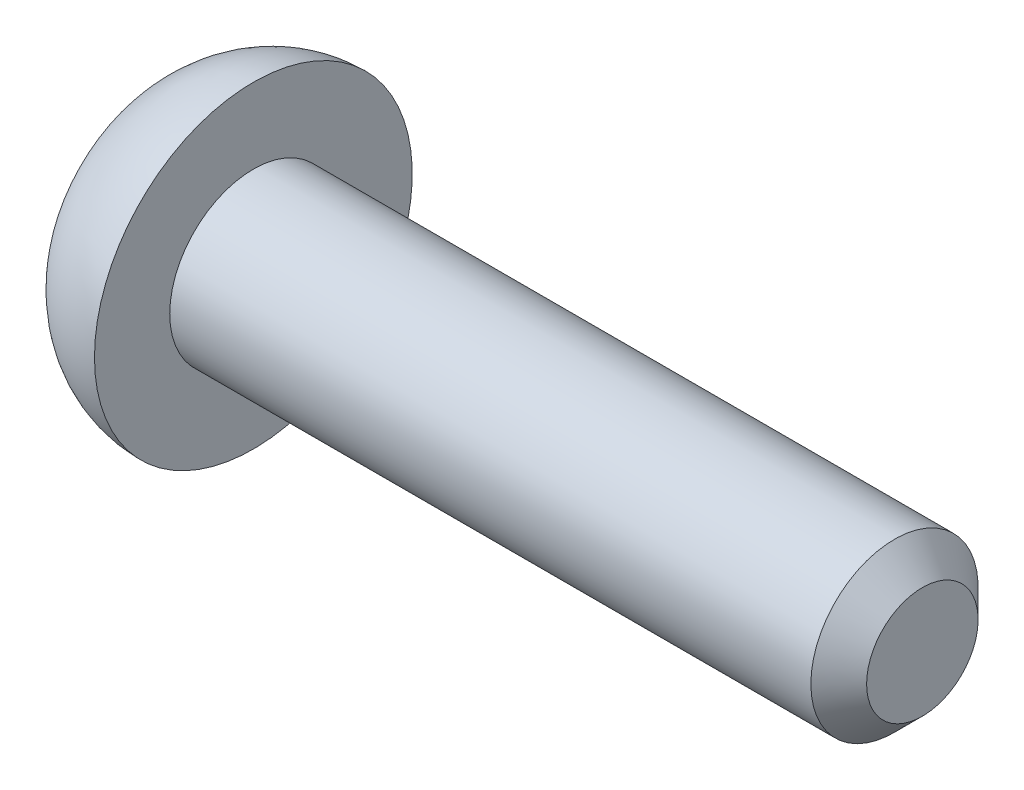
ISO-10303-21;
HEADER;
FILE_DESCRIPTION(('STEP AP214'),'2;1');
FILE_NAME('part.step','',(''),(''),'','','');
FILE_SCHEMA(('AUTOMOTIVE_DESIGN { 1 0 10303 214 1 1 1 1 }'));
ENDSEC;
DATA;
#1=APPLICATION_CONTEXT('core data for automotive mechanical design processes');
#2=APPLICATION_PROTOCOL_DEFINITION('international standard','automotive_design',2000,#1);
#3=PRODUCT_CONTEXT('',#1,'mechanical');
#4=PRODUCT('Part','Part','',(#3));
#5=PRODUCT_RELATED_PRODUCT_CATEGORY('part','',(#4));
#6=PRODUCT_DEFINITION_FORMATION('','',#4);
#7=PRODUCT_DEFINITION_CONTEXT('part definition',#1,'design');
#8=PRODUCT_DEFINITION('design','',#6,#7);
#9=PRODUCT_DEFINITION_SHAPE('','',#8);
#10=(LENGTH_UNIT() NAMED_UNIT(*) SI_UNIT(.MILLI.,.METRE.));
#11=(NAMED_UNIT(*) PLANE_ANGLE_UNIT() SI_UNIT($,.RADIAN.));
#12=(NAMED_UNIT(*) SI_UNIT($,.STERADIAN.) SOLID_ANGLE_UNIT());
#13=UNCERTAINTY_MEASURE_WITH_UNIT(LENGTH_MEASURE(1.E-05),#10,'distance_accuracy_value','');
#14=(GEOMETRIC_REPRESENTATION_CONTEXT(3) GLOBAL_UNCERTAINTY_ASSIGNED_CONTEXT((#13)) GLOBAL_UNIT_ASSIGNED_CONTEXT((#10,
#11,#12)) REPRESENTATION_CONTEXT('',''));
#15=CARTESIAN_POINT('',(0.,0.,0.));
#16=DIRECTION('',(0.,0.,1.));
#17=DIRECTION('',(1.,0.,0.));
#18=AXIS2_PLACEMENT_3D('',#15,#16,#17);
#19=CARTESIAN_POINT('',(-13.65,0.,-2.04903810567666));
#20=DIRECTION('',(1.,0.,0.));
#21=DIRECTION('',(0.,0.,-1.));
#22=AXIS2_PLACEMENT_3D('',#19,#20,#21);
#23=PLANE('',#22);
#24=CARTESIAN_POINT('',(-13.65,0.,0.));
#25=DIRECTION('',(-1.,0.,0.));
#26=DIRECTION('',(0.,0.,1.));
#27=AXIS2_PLACEMENT_3D('',#24,#25,#26);
#28=CIRCLE('',#27,2.04903810567666);
#29=CARTESIAN_POINT('',(-13.65,0.,2.04903810567666));
#30=VERTEX_POINT('',#29);
#31=EDGE_CURVE('E211',#30,#30,#28,.T.);
#32=ORIENTED_EDGE('',*,*,#31,.T.);
#33=EDGE_LOOP('',(#32));
#34=FACE_BOUND('',#33,.T.);
#35=CARTESIAN_POINT('',(-13.65,2.04903810567666,0.));
#36=DIRECTION('',(1.,0.,0.));
#37=DIRECTION('',(0.,0.,1.));
#38=AXIS2_PLACEMENT_3D('',#35,#36,#37);
#39=CIRCLE('',#38,1.02907378905691);
#40=CARTESIAN_POINT('',(-13.65,1.20759961003623,0.592430689092257));
#41=VERTEX_POINT('',#40);
#42=CARTESIAN_POINT('',(-13.65,1.20759961003623,-0.592430689092258));
#43=VERTEX_POINT('',#42);
#44=EDGE_CURVE('E157',#41,#43,#39,.T.);
#45=ORIENTED_EDGE('',*,*,#44,.F.);
#46=CARTESIAN_POINT('',(-13.65,1.12583302491977,0.650000000000001));
#47=DIRECTION('',(-1.,0.,0.));
#48=DIRECTION('',(0.,0.,1.));
#49=AXIS2_PLACEMENT_3D('',#46,#47,#48);
#50=CIRCLE('',#49,0.1);
#51=CARTESIAN_POINT('',(-13.65,1.11685983175353,0.74959659534543));
#52=VERTEX_POINT('',#51);
#53=EDGE_CURVE('E47',#52,#41,#50,.T.);
#54=ORIENTED_EDGE('',*,*,#53,.F.);
#55=CARTESIAN_POINT('',(-13.65,1.02451905283833,1.77451905283833));
#56=DIRECTION('',(1.,0.,0.));
#57=DIRECTION('',(0.,0.,1.));
#58=AXIS2_PLACEMENT_3D('',#55,#56,#57);
#59=CIRCLE('',#58,1.02907378905691);
#60=CARTESIAN_POINT('',(-13.65,0.0907397782827011,1.34202728443769));
#61=VERTEX_POINT('',#60);
#62=EDGE_CURVE('E184',#61,#52,#59,.T.);
#63=ORIENTED_EDGE('',*,*,#62,.F.);
#64=CARTESIAN_POINT('',(-13.65,0.,1.3));
#65=DIRECTION('',(-1.,0.,0.));
#66=DIRECTION('',(0.,0.,1.));
#67=AXIS2_PLACEMENT_3D('',#64,#65,#66);
#68=CIRCLE('',#67,0.1);
#69=CARTESIAN_POINT('',(-13.65,-0.0907397782827009,1.34202728443769));
#70=VERTEX_POINT('',#69);
#71=EDGE_CURVE('E182',#70,#61,#68,.T.);
#72=ORIENTED_EDGE('',*,*,#71,.F.);
#73=CARTESIAN_POINT('',(-13.65,-1.02451905283833,1.77451905283833));
#74=DIRECTION('',(1.,0.,0.));
#75=DIRECTION('',(0.,0.,1.));
#76=AXIS2_PLACEMENT_3D('',#73,#74,#75);
#77=CIRCLE('',#76,1.02907378905691);
#78=CARTESIAN_POINT('',(-13.65,-1.11685983175353,0.74959659534543));
#79=VERTEX_POINT('',#78);
#80=EDGE_CURVE('E131',#79,#70,#77,.T.);
#81=ORIENTED_EDGE('',*,*,#80,.F.);
#82=CARTESIAN_POINT('',(-13.65,-1.12583302491977,0.650000000000001));
#83=DIRECTION('',(-1.,0.,0.));
#84=DIRECTION('',(0.,0.,-1.));
#85=AXIS2_PLACEMENT_3D('',#82,#83,#84);
#86=CIRCLE('',#85,0.0999999999999997);
#87=CARTESIAN_POINT('',(-13.65,-1.20759961003623,0.592430689092258));
#88=VERTEX_POINT('',#87);
#89=EDGE_CURVE('E178',#88,#79,#86,.T.);
#90=ORIENTED_EDGE('',*,*,#89,.F.);
#91=CARTESIAN_POINT('',(-13.65,-2.04903810567666,0.));
#92=DIRECTION('',(1.,0.,0.));
#93=DIRECTION('',(0.,0.,-1.));
#94=AXIS2_PLACEMENT_3D('',#91,#92,#93);
#95=CIRCLE('',#94,1.02907378905691);
#96=CARTESIAN_POINT('',(-13.65,-1.20759961003623,-0.592430689092258));
#97=VERTEX_POINT('',#96);
#98=EDGE_CURVE('E175',#97,#88,#95,.T.);
#99=ORIENTED_EDGE('',*,*,#98,.F.);
#100=CARTESIAN_POINT('',(-13.65,-1.12583302491977,-0.650000000000001));
#101=DIRECTION('',(-1.,0.,0.));
#102=DIRECTION('',(0.,0.,1.));
#103=AXIS2_PLACEMENT_3D('',#100,#101,#102);
#104=CIRCLE('',#103,0.0999999999999999);
#105=CARTESIAN_POINT('',(-13.65,-1.11685983175353,-0.749596595345431));
#106=VERTEX_POINT('',#105);
#107=EDGE_CURVE('E172',#106,#97,#104,.T.);
#108=ORIENTED_EDGE('',*,*,#107,.F.);
#109=CARTESIAN_POINT('',(-13.65,-1.02451905283833,-1.77451905283833));
#110=DIRECTION('',(1.,0.,0.));
#111=DIRECTION('',(0.,0.,1.));
#112=AXIS2_PLACEMENT_3D('',#109,#110,#111);
#113=CIRCLE('',#112,1.02907378905691);
#114=CARTESIAN_POINT('',(-13.65,-0.0907397782827007,-1.34202728443769));
#115=VERTEX_POINT('',#114);
#116=EDGE_CURVE('E169',#115,#106,#113,.T.);
#117=ORIENTED_EDGE('',*,*,#116,.F.);
#118=CARTESIAN_POINT('',(-13.65,0.,-1.3));
#119=DIRECTION('',(-1.,0.,0.));
#120=DIRECTION('',(0.,0.,1.));
#121=AXIS2_PLACEMENT_3D('',#118,#119,#120);
#122=CIRCLE('',#121,0.1);
#123=CARTESIAN_POINT('',(-13.65,0.0907397782827007,-1.34202728443769));
#124=VERTEX_POINT('',#123);
#125=EDGE_CURVE('E166',#124,#115,#122,.T.);
#126=ORIENTED_EDGE('',*,*,#125,.F.);
#127=CARTESIAN_POINT('',(-13.65,1.02451905283833,-1.77451905283833));
#128=DIRECTION('',(1.,0.,0.));
#129=DIRECTION('',(0.,0.,1.));
#130=AXIS2_PLACEMENT_3D('',#127,#128,#129);
#131=CIRCLE('',#130,1.02907378905691);
#132=CARTESIAN_POINT('',(-13.65,1.11685983175353,-0.74959659534543));
#133=VERTEX_POINT('',#132);
#134=EDGE_CURVE('E163',#133,#124,#131,.T.);
#135=ORIENTED_EDGE('',*,*,#134,.F.);
#136=CARTESIAN_POINT('',(-13.65,1.12583302491977,-0.650000000000001));
#137=DIRECTION('',(-1.,0.,0.));
#138=DIRECTION('',(0.,0.,-1.));
#139=AXIS2_PLACEMENT_3D('',#136,#137,#138);
#140=CIRCLE('',#139,0.0999999999999998);
#141=EDGE_CURVE('E160',#43,#133,#140,.T.);
#142=ORIENTED_EDGE('',*,*,#141,.F.);
#143=EDGE_LOOP('',(#45,#54,#63,#72,#81,#90,#99,#108,#117,#126,#135,#142));
#144=FACE_BOUND('',#143,.T.);
#145=ADVANCED_FACE('F32',(#34,#144),#23,.F.);
#146=CARTESIAN_POINT('',(-12.,0.,0.));
#147=DIRECTION('',(-1.,0.,0.));
#148=DIRECTION('',(0.,0.,1.));
#149=AXIS2_PLACEMENT_3D('',#146,#147,#148);
#150=DEGENERATE_TOROIDAL_SURFACE('',#149,0.749999999999999,2.1,.T.);
#151=ORIENTED_EDGE('',*,*,#31,.F.);
#152=EDGE_LOOP('',(#151));
#153=FACE_BOUND('',#152,.T.);
#154=CARTESIAN_POINT('',(-12.,0.,0.));
#155=DIRECTION('',(-1.,0.,0.));
#156=DIRECTION('',(0.,0.,1.));
#157=AXIS2_PLACEMENT_3D('',#154,#155,#156);
#158=CIRCLE('',#157,2.85);
#159=CARTESIAN_POINT('',(-12.,0.,2.85));
#160=VERTEX_POINT('',#159);
#161=EDGE_CURVE('E208',#160,#160,#158,.T.);
#162=ORIENTED_EDGE('',*,*,#161,.T.);
#163=EDGE_LOOP('',(#162));
#164=FACE_BOUND('',#163,.T.);
#165=ADVANCED_FACE('F233',(#153,#164),#150,.T.);
#166=CARTESIAN_POINT('',(-12.,0.,-2.85));
#167=DIRECTION('',(-1.,0.,0.));
#168=DIRECTION('',(0.,0.,1.));
#169=AXIS2_PLACEMENT_3D('',#166,#167,#168);
#170=PLANE('',#169);
#171=ORIENTED_EDGE('',*,*,#161,.F.);
#172=EDGE_LOOP('',(#171));
#173=FACE_BOUND('',#172,.T.);
#174=CARTESIAN_POINT('',(-12.,0.,0.));
#175=DIRECTION('',(-1.,0.,0.));
#176=DIRECTION('',(0.,0.,1.));
#177=AXIS2_PLACEMENT_3D('',#174,#175,#176);
#178=CIRCLE('',#177,1.5);
#179=CARTESIAN_POINT('',(-12.,0.,1.5));
#180=VERTEX_POINT('',#179);
#181=EDGE_CURVE('E188',#180,#180,#178,.T.);
#182=ORIENTED_EDGE('',*,*,#181,.T.);
#183=EDGE_LOOP('',(#182));
#184=FACE_BOUND('',#183,.T.);
#185=ADVANCED_FACE('F238',(#173,#184),#170,.F.);
#186=CARTESIAN_POINT('',(-13.65,0.,0.));
#187=DIRECTION('',(-1.,0.,0.));
#188=DIRECTION('',(0.,0.,1.));
#189=AXIS2_PLACEMENT_3D('',#186,#187,#188);
#190=CYLINDRICAL_SURFACE('',#189,1.5);
#191=CARTESIAN_POINT('',(-0.499999999999997,0.,0.));
#192=DIRECTION('',(-1.,0.,0.));
#193=DIRECTION('',(0.,0.,1.));
#194=AXIS2_PLACEMENT_3D('',#191,#192,#193);
#195=CIRCLE('',#194,1.5);
#196=CARTESIAN_POINT('',(-0.499999999999997,0.,1.5));
#197=VERTEX_POINT('',#196);
#198=EDGE_CURVE('E40',#197,#197,#195,.T.);
#199=ORIENTED_EDGE('',*,*,#198,.T.);
#200=EDGE_LOOP('',(#199));
#201=FACE_BOUND('',#200,.T.);
#202=ORIENTED_EDGE('',*,*,#181,.F.);
#203=EDGE_LOOP('',(#202));
#204=FACE_BOUND('',#203,.T.);
#205=ADVANCED_FACE('F216',(#201,#204),#190,.T.);
#206=CARTESIAN_POINT('',(0.,0.,0.));
#207=DIRECTION('',(-1.,0.,0.));
#208=DIRECTION('',(0.,0.,1.));
#209=AXIS2_PLACEMENT_3D('',#206,#207,#208);
#210=PLANE('',#209);
#211=CARTESIAN_POINT('',(0.,0.,0.));
#212=DIRECTION('',(-1.,0.,0.));
#213=DIRECTION('',(0.,0.,1.));
#214=AXIS2_PLACEMENT_3D('',#211,#212,#213);
#215=CIRCLE('',#214,0.999999999999998);
#216=CARTESIAN_POINT('',(0.,0.,0.999999999999998));
#217=VERTEX_POINT('',#216);
#218=EDGE_CURVE('E11',#217,#217,#215,.F.);
#219=ORIENTED_EDGE('',*,*,#218,.T.);
#220=EDGE_LOOP('',(#219));
#221=FACE_BOUND('',#220,.T.);
#222=ADVANCED_FACE('F221',(#221),#210,.F.);
#223=CARTESIAN_POINT('',(-0.499999999999997,0.,0.));
#224=DIRECTION('',(-1.,0.,0.));
#225=DIRECTION('',(0.,0.,1.));
#226=AXIS2_PLACEMENT_3D('',#223,#224,#225);
#227=CONICAL_SURFACE('',#226,1.5,0.785398163397452);
#228=ORIENTED_EDGE('',*,*,#218,.F.);
#229=EDGE_LOOP('',(#228));
#230=FACE_BOUND('',#229,.T.);
#231=ORIENTED_EDGE('',*,*,#198,.F.);
#232=EDGE_LOOP('',(#231));
#233=FACE_BOUND('',#232,.T.);
#234=ADVANCED_FACE('F34',(#230,#233),#227,.T.);
#235=CARTESIAN_POINT('',(-12.65,1.12583302491977,0.650000000000001));
#236=DIRECTION('',(-1.,0.,0.));
#237=DIRECTION('',(0.,0.,1.));
#238=AXIS2_PLACEMENT_3D('',#235,#236,#237);
#239=CYLINDRICAL_SURFACE('',#238,0.1);
#240=ORIENTED_EDGE('',*,*,#53,.T.);
#241=DIRECTION('',(-1.,0.,0.));
#242=VECTOR('',#241,1.);
#243=CARTESIAN_POINT('',(-12.65,1.20759961003623,0.592430689092257));
#244=LINE('',#243,#242);
#245=CARTESIAN_POINT('',(-12.65,1.20759961003623,0.592430689092257));
#246=VERTEX_POINT('',#245);
#247=EDGE_CURVE('E95',#246,#41,#244,.T.);
#248=ORIENTED_EDGE('',*,*,#247,.F.);
#249=CARTESIAN_POINT('',(-12.65,1.12583302491977,0.650000000000001));
#250=DIRECTION('',(-1.,0.,0.));
#251=DIRECTION('',(0.,0.,1.));
#252=AXIS2_PLACEMENT_3D('',#249,#250,#251);
#253=CIRCLE('',#252,0.1);
#254=CARTESIAN_POINT('',(-12.65,1.11685983175353,0.74959659534543));
#255=VERTEX_POINT('',#254);
#256=EDGE_CURVE('E186',#255,#246,#253,.T.);
#257=ORIENTED_EDGE('',*,*,#256,.F.);
#258=DIRECTION('',(-1.,0.,0.));
#259=VECTOR('',#258,1.);
#260=CARTESIAN_POINT('',(-12.65,1.11685983175353,0.74959659534543));
#261=LINE('',#260,#259);
#262=EDGE_CURVE('E55',#255,#52,#261,.T.);
#263=ORIENTED_EDGE('',*,*,#262,.T.);
#264=EDGE_LOOP('',(#240,#248,#257,#263));
#265=FACE_BOUND('',#264,.T.);
#266=ADVANCED_FACE('F220',(#265),#239,.F.);
#267=CARTESIAN_POINT('',(-12.65,1.02451905283833,1.77451905283833));
#268=DIRECTION('',(-1.,0.,0.));
#269=DIRECTION('',(0.,0.,1.));
#270=AXIS2_PLACEMENT_3D('',#267,#268,#269);
#271=CYLINDRICAL_SURFACE('',#270,1.02907378905691);
#272=ORIENTED_EDGE('',*,*,#62,.T.);
#273=ORIENTED_EDGE('',*,*,#262,.F.);
#274=CARTESIAN_POINT('',(-12.65,1.02451905283833,1.77451905283833));
#275=DIRECTION('',(1.,0.,0.));
#276=DIRECTION('',(0.,0.,1.));
#277=AXIS2_PLACEMENT_3D('',#274,#275,#276);
#278=CIRCLE('',#277,1.02907378905691);
#279=CARTESIAN_POINT('',(-12.65,0.0907397782827011,1.34202728443769));
#280=VERTEX_POINT('',#279);
#281=EDGE_CURVE('E143',#280,#255,#278,.T.);
#282=ORIENTED_EDGE('',*,*,#281,.F.);
#283=DIRECTION('',(-1.,0.,0.));
#284=VECTOR('',#283,1.);
#285=CARTESIAN_POINT('',(-12.65,0.0907397782827011,1.34202728443769));
#286=LINE('',#285,#284);
#287=EDGE_CURVE('E135',#280,#61,#286,.T.);
#288=ORIENTED_EDGE('',*,*,#287,.T.);
#289=EDGE_LOOP('',(#272,#273,#282,#288));
#290=FACE_BOUND('',#289,.T.);
#291=ADVANCED_FACE('F227',(#290),#271,.T.);
#292=CARTESIAN_POINT('',(-12.65,0.,1.3));
#293=DIRECTION('',(-1.,0.,0.));
#294=DIRECTION('',(0.,0.,1.));
#295=AXIS2_PLACEMENT_3D('',#292,#293,#294);
#296=CYLINDRICAL_SURFACE('',#295,0.1);
#297=ORIENTED_EDGE('',*,*,#71,.T.);
#298=ORIENTED_EDGE('',*,*,#287,.F.);
#299=CARTESIAN_POINT('',(-12.65,0.,1.3));
#300=DIRECTION('',(-1.,0.,0.));
#301=DIRECTION('',(0.,0.,1.));
#302=AXIS2_PLACEMENT_3D('',#299,#300,#301);
#303=CIRCLE('',#302,0.1);
#304=CARTESIAN_POINT('',(-12.65,-0.0907397782827009,1.34202728443769));
#305=VERTEX_POINT('',#304);
#306=EDGE_CURVE('E139',#305,#280,#303,.T.);
#307=ORIENTED_EDGE('',*,*,#306,.F.);
#308=DIRECTION('',(-1.,0.,0.));
#309=VECTOR('',#308,1.);
#310=CARTESIAN_POINT('',(-12.65,-0.0907397782827009,1.34202728443769));
#311=LINE('',#310,#309);
#312=EDGE_CURVE('E124',#305,#70,#311,.T.);
#313=ORIENTED_EDGE('',*,*,#312,.T.);
#314=EDGE_LOOP('',(#297,#298,#307,#313));
#315=FACE_BOUND('',#314,.T.);
#316=ADVANCED_FACE('F140',(#315),#296,.F.);
#317=CARTESIAN_POINT('',(-12.65,-1.02451905283833,1.77451905283833));
#318=DIRECTION('',(-1.,0.,0.));
#319=DIRECTION('',(0.,0.,1.));
#320=AXIS2_PLACEMENT_3D('',#317,#318,#319);
#321=CYLINDRICAL_SURFACE('',#320,1.02907378905691);
#322=ORIENTED_EDGE('',*,*,#80,.T.);
#323=ORIENTED_EDGE('',*,*,#312,.F.);
#324=CARTESIAN_POINT('',(-12.65,-1.02451905283833,1.77451905283833));
#325=DIRECTION('',(1.,0.,0.));
#326=DIRECTION('',(0.,0.,1.));
#327=AXIS2_PLACEMENT_3D('',#324,#325,#326);
#328=CIRCLE('',#327,1.02907378905691);
#329=CARTESIAN_POINT('',(-12.65,-1.11685983175353,0.74959659534543));
#330=VERTEX_POINT('',#329);
#331=EDGE_CURVE('E128',#330,#305,#328,.T.);
#332=ORIENTED_EDGE('',*,*,#331,.F.);
#333=DIRECTION('',(-1.,0.,0.));
#334=VECTOR('',#333,1.);
#335=CARTESIAN_POINT('',(-12.65,-1.11685983175353,0.74959659534543));
#336=LINE('',#335,#334);
#337=EDGE_CURVE('E136',#330,#79,#336,.T.);
#338=ORIENTED_EDGE('',*,*,#337,.T.);
#339=EDGE_LOOP('',(#322,#323,#332,#338));
#340=FACE_BOUND('',#339,.T.);
#341=ADVANCED_FACE('F126',(#340),#321,.T.);
#342=CARTESIAN_POINT('',(-12.65,-1.12583302491977,0.650000000000001));
#343=DIRECTION('',(-1.,0.,0.));
#344=DIRECTION('',(0.,0.,1.));
#345=AXIS2_PLACEMENT_3D('',#342,#343,#344);
#346=CYLINDRICAL_SURFACE('',#345,0.0999999999999997);
#347=ORIENTED_EDGE('',*,*,#89,.T.);
#348=ORIENTED_EDGE('',*,*,#337,.F.);
#349=CARTESIAN_POINT('',(-12.65,-1.12583302491977,0.650000000000001));
#350=DIRECTION('',(-1.,0.,0.));
#351=DIRECTION('',(0.,0.,-1.));
#352=AXIS2_PLACEMENT_3D('',#349,#350,#351);
#353=CIRCLE('',#352,0.0999999999999997);
#354=CARTESIAN_POINT('',(-12.65,-1.20759961003623,0.592430689092258));
#355=VERTEX_POINT('',#354);
#356=EDGE_CURVE('E149',#355,#330,#353,.T.);
#357=ORIENTED_EDGE('',*,*,#356,.F.);
#358=DIRECTION('',(-1.,0.,0.));
#359=VECTOR('',#358,1.);
#360=CARTESIAN_POINT('',(-12.65,-1.20759961003623,0.592430689092258));
#361=LINE('',#360,#359);
#362=EDGE_CURVE('E191',#355,#88,#361,.T.);
#363=ORIENTED_EDGE('',*,*,#362,.T.);
#364=EDGE_LOOP('',(#347,#348,#357,#363));
#365=FACE_BOUND('',#364,.T.);
#366=ADVANCED_FACE('F275',(#365),#346,.F.);
#367=CARTESIAN_POINT('',(-12.65,-2.04903810567666,0.));
#368=DIRECTION('',(-1.,0.,0.));
#369=DIRECTION('',(0.,0.,1.));
#370=AXIS2_PLACEMENT_3D('',#367,#368,#369);
#371=CYLINDRICAL_SURFACE('',#370,1.02907378905691);
#372=ORIENTED_EDGE('',*,*,#98,.T.);
#373=ORIENTED_EDGE('',*,*,#362,.F.);
#374=CARTESIAN_POINT('',(-12.65,-2.04903810567666,0.));
#375=DIRECTION('',(1.,0.,0.));
#376=DIRECTION('',(0.,0.,-1.));
#377=AXIS2_PLACEMENT_3D('',#374,#375,#376);
#378=CIRCLE('',#377,1.02907378905691);
#379=CARTESIAN_POINT('',(-12.65,-1.20759961003623,-0.592430689092258));
#380=VERTEX_POINT('',#379);
#381=EDGE_CURVE('E151',#380,#355,#378,.T.);
#382=ORIENTED_EDGE('',*,*,#381,.F.);
#383=DIRECTION('',(-1.,0.,0.));
#384=VECTOR('',#383,1.);
#385=CARTESIAN_POINT('',(-12.65,-1.20759961003623,-0.592430689092258));
#386=LINE('',#385,#384);
#387=EDGE_CURVE('E193',#380,#97,#386,.T.);
#388=ORIENTED_EDGE('',*,*,#387,.T.);
#389=EDGE_LOOP('',(#372,#373,#382,#388));
#390=FACE_BOUND('',#389,.T.);
#391=ADVANCED_FACE('F271',(#390),#371,.T.);
#392=CARTESIAN_POINT('',(-12.65,-1.12583302491977,-0.650000000000001));
#393=DIRECTION('',(-1.,0.,0.));
#394=DIRECTION('',(0.,0.,1.));
#395=AXIS2_PLACEMENT_3D('',#392,#393,#394);
#396=CYLINDRICAL_SURFACE('',#395,0.0999999999999999);
#397=ORIENTED_EDGE('',*,*,#107,.T.);
#398=ORIENTED_EDGE('',*,*,#387,.F.);
#399=CARTESIAN_POINT('',(-12.65,-1.12583302491977,-0.650000000000001));
#400=DIRECTION('',(-1.,0.,0.));
#401=DIRECTION('',(0.,0.,1.));
#402=AXIS2_PLACEMENT_3D('',#399,#400,#401);
#403=CIRCLE('',#402,0.0999999999999999);
#404=CARTESIAN_POINT('',(-12.65,-1.11685983175353,-0.749596595345431));
#405=VERTEX_POINT('',#404);
#406=EDGE_CURVE('E419',#405,#380,#403,.T.);
#407=ORIENTED_EDGE('',*,*,#406,.F.);
#408=DIRECTION('',(-1.,0.,0.));
#409=VECTOR('',#408,1.);
#410=CARTESIAN_POINT('',(-12.65,-1.11685983175353,-0.749596595345431));
#411=LINE('',#410,#409);
#412=EDGE_CURVE('E195',#405,#106,#411,.T.);
#413=ORIENTED_EDGE('',*,*,#412,.T.);
#414=EDGE_LOOP('',(#397,#398,#407,#413));
#415=FACE_BOUND('',#414,.T.);
#416=ADVANCED_FACE('F267',(#415),#396,.F.);
#417=CARTESIAN_POINT('',(-12.65,-1.02451905283833,-1.77451905283833));
#418=DIRECTION('',(-1.,0.,0.));
#419=DIRECTION('',(0.,0.,1.));
#420=AXIS2_PLACEMENT_3D('',#417,#418,#419);
#421=CYLINDRICAL_SURFACE('',#420,1.02907378905691);
#422=ORIENTED_EDGE('',*,*,#116,.T.);
#423=ORIENTED_EDGE('',*,*,#412,.F.);
#424=CARTESIAN_POINT('',(-12.65,-1.02451905283833,-1.77451905283833));
#425=DIRECTION('',(1.,0.,0.));
#426=DIRECTION('',(0.,0.,1.));
#427=AXIS2_PLACEMENT_3D('',#424,#425,#426);
#428=CIRCLE('',#427,1.02907378905691);
#429=CARTESIAN_POINT('',(-12.65,-0.0907397782827007,-1.34202728443769));
#430=VERTEX_POINT('',#429);
#431=EDGE_CURVE('E416',#430,#405,#428,.T.);
#432=ORIENTED_EDGE('',*,*,#431,.F.);
#433=DIRECTION('',(-1.,0.,0.));
#434=VECTOR('',#433,1.);
#435=CARTESIAN_POINT('',(-12.65,-0.0907397782827007,-1.34202728443769));
#436=LINE('',#435,#434);
#437=EDGE_CURVE('E197',#430,#115,#436,.T.);
#438=ORIENTED_EDGE('',*,*,#437,.T.);
#439=EDGE_LOOP('',(#422,#423,#432,#438));
#440=FACE_BOUND('',#439,.T.);
#441=ADVANCED_FACE('F263',(#440),#421,.T.);
#442=CARTESIAN_POINT('',(-12.65,0.,-1.3));
#443=DIRECTION('',(-1.,0.,0.));
#444=DIRECTION('',(0.,0.,1.));
#445=AXIS2_PLACEMENT_3D('',#442,#443,#444);
#446=CYLINDRICAL_SURFACE('',#445,0.1);
#447=ORIENTED_EDGE('',*,*,#125,.T.);
#448=ORIENTED_EDGE('',*,*,#437,.F.);
#449=CARTESIAN_POINT('',(-12.65,0.,-1.3));
#450=DIRECTION('',(-1.,0.,0.));
#451=DIRECTION('',(0.,0.,1.));
#452=AXIS2_PLACEMENT_3D('',#449,#450,#451);
#453=CIRCLE('',#452,0.1);
#454=CARTESIAN_POINT('',(-12.65,0.0907397782827007,-1.34202728443769));
#455=VERTEX_POINT('',#454);
#456=EDGE_CURVE('E413',#455,#430,#453,.T.);
#457=ORIENTED_EDGE('',*,*,#456,.F.);
#458=DIRECTION('',(-1.,0.,0.));
#459=VECTOR('',#458,1.);
#460=CARTESIAN_POINT('',(-12.65,0.0907397782827007,-1.34202728443769));
#461=LINE('',#460,#459);
#462=EDGE_CURVE('E199',#455,#124,#461,.T.);
#463=ORIENTED_EDGE('',*,*,#462,.T.);
#464=EDGE_LOOP('',(#447,#448,#457,#463));
#465=FACE_BOUND('',#464,.T.);
#466=ADVANCED_FACE('F259',(#465),#446,.F.);
#467=CARTESIAN_POINT('',(-12.65,1.02451905283833,-1.77451905283833));
#468=DIRECTION('',(-1.,0.,0.));
#469=DIRECTION('',(0.,0.,1.));
#470=AXIS2_PLACEMENT_3D('',#467,#468,#469);
#471=CYLINDRICAL_SURFACE('',#470,1.02907378905691);
#472=ORIENTED_EDGE('',*,*,#134,.T.);
#473=ORIENTED_EDGE('',*,*,#462,.F.);
#474=CARTESIAN_POINT('',(-12.65,1.02451905283833,-1.77451905283833));
#475=DIRECTION('',(1.,0.,0.));
#476=DIRECTION('',(0.,0.,1.));
#477=AXIS2_PLACEMENT_3D('',#474,#475,#476);
#478=CIRCLE('',#477,1.02907378905691);
#479=CARTESIAN_POINT('',(-12.65,1.11685983175353,-0.74959659534543));
#480=VERTEX_POINT('',#479);
#481=EDGE_CURVE('E410',#480,#455,#478,.T.);
#482=ORIENTED_EDGE('',*,*,#481,.F.);
#483=DIRECTION('',(-1.,0.,0.));
#484=VECTOR('',#483,1.);
#485=CARTESIAN_POINT('',(-12.65,1.11685983175353,-0.74959659534543));
#486=LINE('',#485,#484);
#487=EDGE_CURVE('E201',#480,#133,#486,.T.);
#488=ORIENTED_EDGE('',*,*,#487,.T.);
#489=EDGE_LOOP('',(#472,#473,#482,#488));
#490=FACE_BOUND('',#489,.T.);
#491=ADVANCED_FACE('F255',(#490),#471,.T.);
#492=CARTESIAN_POINT('',(-12.65,1.12583302491977,-0.650000000000001));
#493=DIRECTION('',(-1.,0.,0.));
#494=DIRECTION('',(0.,0.,1.));
#495=AXIS2_PLACEMENT_3D('',#492,#493,#494);
#496=CYLINDRICAL_SURFACE('',#495,0.0999999999999998);
#497=ORIENTED_EDGE('',*,*,#141,.T.);
#498=ORIENTED_EDGE('',*,*,#487,.F.);
#499=CARTESIAN_POINT('',(-12.65,1.12583302491977,-0.650000000000001));
#500=DIRECTION('',(-1.,0.,0.));
#501=DIRECTION('',(0.,0.,-1.));
#502=AXIS2_PLACEMENT_3D('',#499,#500,#501);
#503=CIRCLE('',#502,0.0999999999999998);
#504=CARTESIAN_POINT('',(-12.65,1.20759961003623,-0.592430689092258));
#505=VERTEX_POINT('',#504);
#506=EDGE_CURVE('E405',#505,#480,#503,.T.);
#507=ORIENTED_EDGE('',*,*,#506,.F.);
#508=DIRECTION('',(-1.,0.,0.));
#509=VECTOR('',#508,1.);
#510=CARTESIAN_POINT('',(-12.65,1.20759961003623,-0.592430689092258));
#511=LINE('',#510,#509);
#512=EDGE_CURVE('E203',#505,#43,#511,.T.);
#513=ORIENTED_EDGE('',*,*,#512,.T.);
#514=EDGE_LOOP('',(#497,#498,#507,#513));
#515=FACE_BOUND('',#514,.T.);
#516=ADVANCED_FACE('F251',(#515),#496,.F.);
#517=CARTESIAN_POINT('',(-12.65,2.04903810567666,0.));
#518=DIRECTION('',(-1.,0.,0.));
#519=DIRECTION('',(0.,0.,1.));
#520=AXIS2_PLACEMENT_3D('',#517,#518,#519);
#521=CYLINDRICAL_SURFACE('',#520,1.02907378905691);
#522=ORIENTED_EDGE('',*,*,#44,.T.);
#523=ORIENTED_EDGE('',*,*,#512,.F.);
#524=CARTESIAN_POINT('',(-12.65,2.04903810567666,0.));
#525=DIRECTION('',(1.,0.,0.));
#526=DIRECTION('',(0.,0.,1.));
#527=AXIS2_PLACEMENT_3D('',#524,#525,#526);
#528=CIRCLE('',#527,1.02907378905691);
#529=EDGE_CURVE('E403',#246,#505,#528,.T.);
#530=ORIENTED_EDGE('',*,*,#529,.F.);
#531=ORIENTED_EDGE('',*,*,#247,.T.);
#532=EDGE_LOOP('',(#522,#523,#530,#531));
#533=FACE_BOUND('',#532,.T.);
#534=ADVANCED_FACE('F248',(#533),#521,.T.);
#535=CARTESIAN_POINT('',(-12.65,1.58743556529821,0.325));
#536=DIRECTION('',(-1.,0.,0.));
#537=DIRECTION('',(0.,0.,1.));
#538=AXIS2_PLACEMENT_3D('',#535,#536,#537);
#539=PLANE('',#538);
#540=ORIENTED_EDGE('',*,*,#256,.T.);
#541=ORIENTED_EDGE('',*,*,#529,.T.);
#542=ORIENTED_EDGE('',*,*,#506,.T.);
#543=ORIENTED_EDGE('',*,*,#481,.T.);
#544=ORIENTED_EDGE('',*,*,#456,.T.);
#545=ORIENTED_EDGE('',*,*,#431,.T.);
#546=ORIENTED_EDGE('',*,*,#406,.T.);
#547=ORIENTED_EDGE('',*,*,#381,.T.);
#548=ORIENTED_EDGE('',*,*,#356,.T.);
#549=ORIENTED_EDGE('',*,*,#331,.T.);
#550=ORIENTED_EDGE('',*,*,#306,.T.);
#551=ORIENTED_EDGE('',*,*,#281,.T.);
#552=EDGE_LOOP('',(#540,#541,#542,#543,#544,#545,#546,#547,#548,#549,#550,#551));
#553=FACE_BOUND('',#552,.T.);
#554=ADVANCED_FACE('F146',(#553),#539,.T.);
#555=CLOSED_SHELL('',(#145,#165,#185,#205,#222,#234,#266,#291,#316,#341,#366,#391,#416,#441,
#466,#491,#516,#534,#554));
#556=MANIFOLD_SOLID_BREP('B2',#555);
#557=ADVANCED_BREP_SHAPE_REPRESENTATION('',(#18,#556),#14);
#558=SHAPE_DEFINITION_REPRESENTATION(#9,#557);
ENDSEC;
END-ISO-10303-21;
